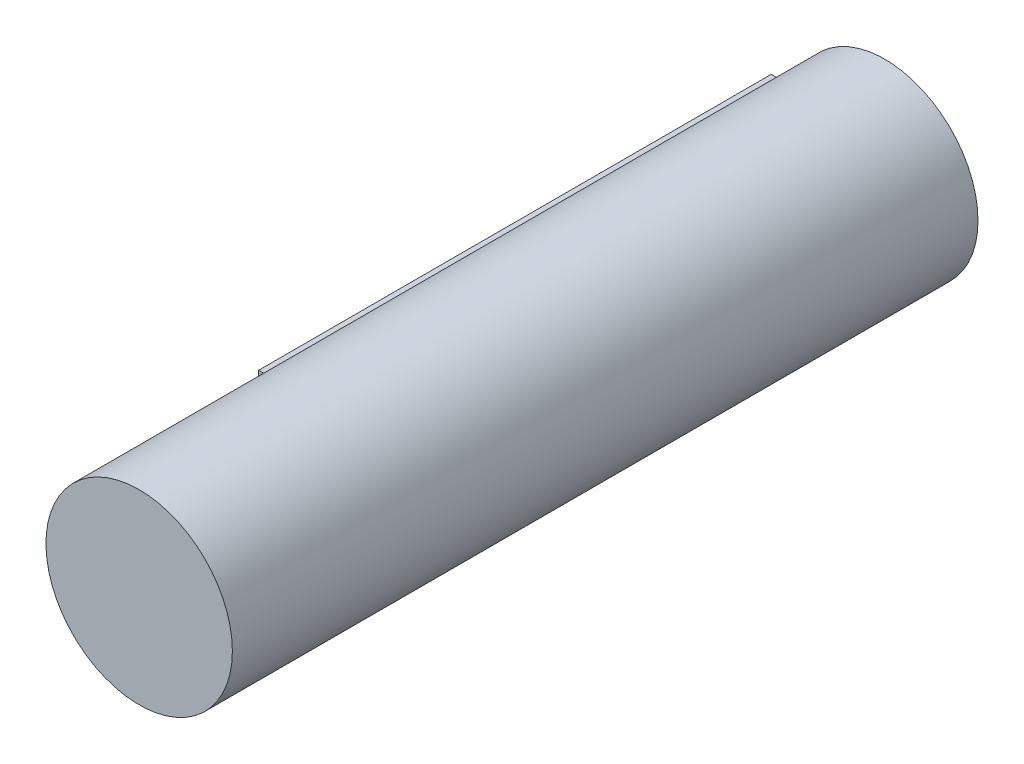
ISO-10303-21;
HEADER;
FILE_DESCRIPTION(('STEP AP214'),'2;1');
FILE_NAME('part.step','',(''),(''),'','','');
FILE_SCHEMA(('AUTOMOTIVE_DESIGN { 1 0 10303 214 1 1 1 1 }'));
ENDSEC;
DATA;
#1=APPLICATION_CONTEXT('core data for automotive mechanical design processes');
#2=APPLICATION_PROTOCOL_DEFINITION('international standard','automotive_design',2000,#1);
#3=PRODUCT_CONTEXT('',#1,'mechanical');
#4=PRODUCT('Part','Part','',(#3));
#5=PRODUCT_RELATED_PRODUCT_CATEGORY('part','',(#4));
#6=PRODUCT_DEFINITION_FORMATION('','',#4);
#7=PRODUCT_DEFINITION_CONTEXT('part definition',#1,'design');
#8=PRODUCT_DEFINITION('design','',#6,#7);
#9=PRODUCT_DEFINITION_SHAPE('','',#8);
#10=(LENGTH_UNIT() NAMED_UNIT(*) SI_UNIT(.MILLI.,.METRE.));
#11=(NAMED_UNIT(*) PLANE_ANGLE_UNIT() SI_UNIT($,.RADIAN.));
#12=(NAMED_UNIT(*) SI_UNIT($,.STERADIAN.) SOLID_ANGLE_UNIT());
#13=UNCERTAINTY_MEASURE_WITH_UNIT(LENGTH_MEASURE(1.E-05),#10,'distance_accuracy_value','');
#14=(GEOMETRIC_REPRESENTATION_CONTEXT(3) GLOBAL_UNCERTAINTY_ASSIGNED_CONTEXT((#13)) GLOBAL_UNIT_ASSIGNED_CONTEXT((#10,
#11,#12)) REPRESENTATION_CONTEXT('',''));
#15=CARTESIAN_POINT('',(0.,0.,0.));
#16=DIRECTION('',(0.,0.,1.));
#17=DIRECTION('',(1.,0.,0.));
#18=AXIS2_PLACEMENT_3D('',#15,#16,#17);
#19=CARTESIAN_POINT('',(0.,0.,160.));
#20=DIRECTION('',(0.,0.,-1.));
#21=DIRECTION('',(-1.,0.,0.));
#22=AXIS2_PLACEMENT_3D('',#19,#20,#21);
#23=CYLINDRICAL_SURFACE('',#22,20.);
#24=CARTESIAN_POINT('',(0.,0.,110.));
#25=DIRECTION('',(0.,0.,1.));
#26=DIRECTION('',(1.,0.,0.));
#27=AXIS2_PLACEMENT_3D('',#24,#25,#26);
#28=CIRCLE('',#27,20.);
#29=CARTESIAN_POINT('',(-19.3649167310371,5.,110.));
#30=VERTEX_POINT('',#29);
#31=CARTESIAN_POINT('',(-19.3649167310371,-5.,110.));
#32=VERTEX_POINT('',#31);
#33=EDGE_CURVE('E52',#30,#32,#28,.T.);
#34=ORIENTED_EDGE('',*,*,#33,.T.);
#35=DIRECTION('',(0.,0.,-1.));
#36=VECTOR('',#35,1.);
#37=CARTESIAN_POINT('',(-19.3649167310371,-5.,110.));
#38=LINE('',#37,#36);
#39=CARTESIAN_POINT('',(-19.3649167310371,-5.,0.));
#40=VERTEX_POINT('',#39);
#41=EDGE_CURVE('E97',#32,#40,#38,.T.);
#42=ORIENTED_EDGE('',*,*,#41,.T.);
#43=CARTESIAN_POINT('',(0.,0.,0.));
#44=DIRECTION('',(0.,0.,1.));
#45=DIRECTION('',(1.,0.,0.));
#46=AXIS2_PLACEMENT_3D('',#43,#44,#45);
#47=CIRCLE('',#46,20.);
#48=CARTESIAN_POINT('',(-19.3649167310371,5.,0.));
#49=VERTEX_POINT('',#48);
#50=EDGE_CURVE('E41',#40,#49,#47,.T.);
#51=ORIENTED_EDGE('',*,*,#50,.T.);
#52=DIRECTION('',(0.,0.,-1.));
#53=VECTOR('',#52,1.);
#54=CARTESIAN_POINT('',(-19.3649167310371,5.,110.));
#55=LINE('',#54,#53);
#56=EDGE_CURVE('E57',#30,#49,#55,.T.);
#57=ORIENTED_EDGE('',*,*,#56,.F.);
#58=EDGE_LOOP('',(#34,#42,#51,#57));
#59=FACE_BOUND('',#58,.T.);
#60=CARTESIAN_POINT('',(0.,0.,160.));
#61=DIRECTION('',(0.,0.,1.));
#62=DIRECTION('',(1.,0.,0.));
#63=AXIS2_PLACEMENT_3D('',#60,#61,#62);
#64=CIRCLE('',#63,20.);
#65=CARTESIAN_POINT('',(20.,0.,160.));
#66=VERTEX_POINT('',#65);
#67=EDGE_CURVE('E11',#66,#66,#64,.T.);
#68=ORIENTED_EDGE('',*,*,#67,.F.);
#69=EDGE_LOOP('',(#68));
#70=FACE_BOUND('',#69,.T.);
#71=ADVANCED_FACE('F38',(#59,#70),#23,.T.);
#72=CARTESIAN_POINT('',(0.,0.,160.));
#73=DIRECTION('',(0.,0.,1.));
#74=DIRECTION('',(1.,0.,0.));
#75=AXIS2_PLACEMENT_3D('',#72,#73,#74);
#76=PLANE('',#75);
#77=ORIENTED_EDGE('',*,*,#67,.T.);
#78=EDGE_LOOP('',(#77));
#79=FACE_BOUND('',#78,.T.);
#80=ADVANCED_FACE('F126',(#79),#76,.T.);
#81=CARTESIAN_POINT('',(0.,0.,0.));
#82=DIRECTION('',(0.,0.,1.));
#83=DIRECTION('',(1.,0.,0.));
#84=AXIS2_PLACEMENT_3D('',#81,#82,#83);
#85=PLANE('',#84);
#86=ORIENTED_EDGE('',*,*,#50,.F.);
#87=DIRECTION('',(-1.,0.,0.));
#88=VECTOR('',#87,1.);
#89=CARTESIAN_POINT('',(0.,-5.,0.));
#90=LINE('',#89,#88);
#91=CARTESIAN_POINT('',(-24.3649167310371,-5.,0.));
#92=VERTEX_POINT('',#91);
#93=EDGE_CURVE('E106',#40,#92,#90,.T.);
#94=ORIENTED_EDGE('',*,*,#93,.T.);
#95=DIRECTION('',(0.,-1.,0.));
#96=VECTOR('',#95,1.);
#97=CARTESIAN_POINT('',(-24.3649167310371,0.,0.));
#98=LINE('',#97,#96);
#99=CARTESIAN_POINT('',(-24.3649167310371,5.,0.));
#100=VERTEX_POINT('',#99);
#101=EDGE_CURVE('E93',#100,#92,#98,.T.);
#102=ORIENTED_EDGE('',*,*,#101,.F.);
#103=DIRECTION('',(-1.,0.,0.));
#104=VECTOR('',#103,1.);
#105=CARTESIAN_POINT('',(0.,5.,0.));
#106=LINE('',#105,#104);
#107=EDGE_CURVE('E87',#49,#100,#106,.T.);
#108=ORIENTED_EDGE('',*,*,#107,.F.);
#109=EDGE_LOOP('',(#86,#94,#102,#108));
#110=FACE_BOUND('',#109,.T.);
#111=ADVANCED_FACE('F113',(#110),#85,.F.);
#112=CARTESIAN_POINT('',(-24.3649167310371,0.,110.));
#113=DIRECTION('',(1.,0.,0.));
#114=DIRECTION('',(0.,1.,0.));
#115=AXIS2_PLACEMENT_3D('',#112,#113,#114);
#116=PLANE('',#115);
#117=ORIENTED_EDGE('',*,*,#101,.T.);
#118=DIRECTION('',(0.,0.,-1.));
#119=VECTOR('',#118,1.);
#120=CARTESIAN_POINT('',(-24.3649167310371,-5.,110.));
#121=LINE('',#120,#119);
#122=CARTESIAN_POINT('',(-24.3649167310371,-5.,110.));
#123=VERTEX_POINT('',#122);
#124=EDGE_CURVE('E90',#123,#92,#121,.T.);
#125=ORIENTED_EDGE('',*,*,#124,.F.);
#126=DIRECTION('',(0.,-1.,0.));
#127=VECTOR('',#126,1.);
#128=CARTESIAN_POINT('',(-24.3649167310371,0.,110.));
#129=LINE('',#128,#127);
#130=CARTESIAN_POINT('',(-24.3649167310371,5.,110.));
#131=VERTEX_POINT('',#130);
#132=EDGE_CURVE('E78',#131,#123,#129,.T.);
#133=ORIENTED_EDGE('',*,*,#132,.F.);
#134=DIRECTION('',(0.,0.,-1.));
#135=VECTOR('',#134,1.);
#136=CARTESIAN_POINT('',(-24.3649167310371,5.,110.));
#137=LINE('',#136,#135);
#138=EDGE_CURVE('E104',#131,#100,#137,.T.);
#139=ORIENTED_EDGE('',*,*,#138,.T.);
#140=EDGE_LOOP('',(#117,#125,#133,#139));
#141=FACE_BOUND('',#140,.T.);
#142=ADVANCED_FACE('F91',(#141),#116,.F.);
#143=CARTESIAN_POINT('',(0.,-5.,110.));
#144=DIRECTION('',(0.,-1.,0.));
#145=DIRECTION('',(1.,0.,0.));
#146=AXIS2_PLACEMENT_3D('',#143,#144,#145);
#147=PLANE('',#146);
#148=ORIENTED_EDGE('',*,*,#93,.F.);
#149=ORIENTED_EDGE('',*,*,#41,.F.);
#150=DIRECTION('',(-1.,0.,0.));
#151=VECTOR('',#150,1.);
#152=CARTESIAN_POINT('',(0.,-5.,110.));
#153=LINE('',#152,#151);
#154=EDGE_CURVE('E82',#32,#123,#153,.T.);
#155=ORIENTED_EDGE('',*,*,#154,.T.);
#156=ORIENTED_EDGE('',*,*,#124,.T.);
#157=EDGE_LOOP('',(#148,#149,#155,#156));
#158=FACE_BOUND('',#157,.T.);
#159=ADVANCED_FACE('F99',(#158),#147,.T.);
#160=CARTESIAN_POINT('',(0.,5.,110.));
#161=DIRECTION('',(0.,-1.,0.));
#162=DIRECTION('',(0.,0.,-1.));
#163=AXIS2_PLACEMENT_3D('',#160,#161,#162);
#164=PLANE('',#163);
#165=ORIENTED_EDGE('',*,*,#107,.T.);
#166=ORIENTED_EDGE('',*,*,#138,.F.);
#167=DIRECTION('',(-1.,0.,0.));
#168=VECTOR('',#167,1.);
#169=CARTESIAN_POINT('',(0.,5.,110.));
#170=LINE('',#169,#168);
#171=EDGE_CURVE('E83',#30,#131,#170,.T.);
#172=ORIENTED_EDGE('',*,*,#171,.F.);
#173=ORIENTED_EDGE('',*,*,#56,.T.);
#174=EDGE_LOOP('',(#165,#166,#172,#173));
#175=FACE_BOUND('',#174,.T.);
#176=ADVANCED_FACE('F116',(#175),#164,.F.);
#177=CARTESIAN_POINT('',(0.,0.,110.));
#178=DIRECTION('',(0.,0.,1.));
#179=DIRECTION('',(1.,0.,0.));
#180=AXIS2_PLACEMENT_3D('',#177,#178,#179);
#181=PLANE('',#180);
#182=ORIENTED_EDGE('',*,*,#132,.T.);
#183=ORIENTED_EDGE('',*,*,#154,.F.);
#184=ORIENTED_EDGE('',*,*,#33,.F.);
#185=ORIENTED_EDGE('',*,*,#171,.T.);
#186=EDGE_LOOP('',(#182,#183,#184,#185));
#187=FACE_BOUND('',#186,.T.);
#188=ADVANCED_FACE('F80',(#187),#181,.T.);
#189=CLOSED_SHELL('',(#71,#80,#111,#142,#159,#176,#188));
#190=MANIFOLD_SOLID_BREP('B2',#189);
#191=ADVANCED_BREP_SHAPE_REPRESENTATION('',(#18,#190),#14);
#192=SHAPE_DEFINITION_REPRESENTATION(#9,#191);
ENDSEC;
END-ISO-10303-21;
